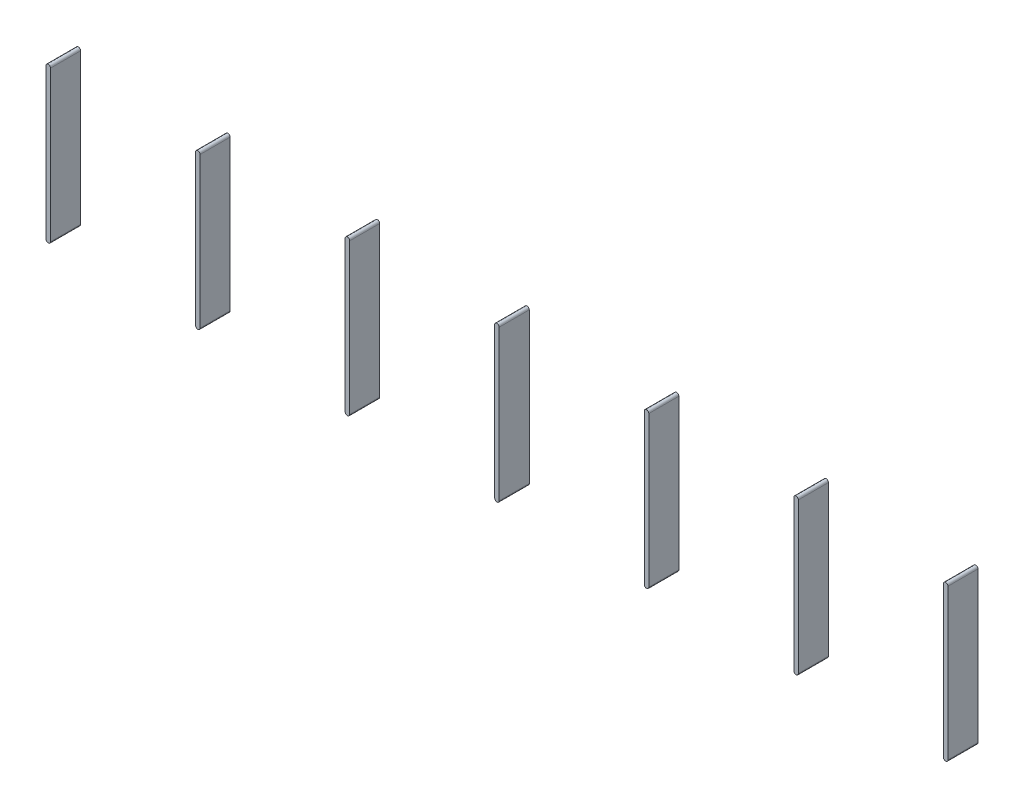
ISO-10303-21;
HEADER;
FILE_DESCRIPTION(('STEP AP214'),'2;1');
FILE_NAME('part.step','',(''),(''),'','','');
FILE_SCHEMA(('AUTOMOTIVE_DESIGN { 1 0 10303 214 1 1 1 1 }'));
ENDSEC;
DATA;
#1=APPLICATION_CONTEXT('core data for automotive mechanical design processes');
#2=APPLICATION_PROTOCOL_DEFINITION('international standard','automotive_design',2000,#1);
#3=PRODUCT_CONTEXT('',#1,'mechanical');
#4=PRODUCT('Part','Part','',(#3));
#5=PRODUCT_RELATED_PRODUCT_CATEGORY('part','',(#4));
#6=PRODUCT_DEFINITION_FORMATION('','',#4);
#7=PRODUCT_DEFINITION_CONTEXT('part definition',#1,'design');
#8=PRODUCT_DEFINITION('design','',#6,#7);
#9=PRODUCT_DEFINITION_SHAPE('','',#8);
#10=(LENGTH_UNIT() NAMED_UNIT(*) SI_UNIT(.MILLI.,.METRE.));
#11=(NAMED_UNIT(*) PLANE_ANGLE_UNIT() SI_UNIT($,.RADIAN.));
#12=(NAMED_UNIT(*) SI_UNIT($,.STERADIAN.) SOLID_ANGLE_UNIT());
#13=UNCERTAINTY_MEASURE_WITH_UNIT(LENGTH_MEASURE(1.E-05),#10,'distance_accuracy_value','');
#14=(GEOMETRIC_REPRESENTATION_CONTEXT(3) GLOBAL_UNCERTAINTY_ASSIGNED_CONTEXT((#13)) GLOBAL_UNIT_ASSIGNED_CONTEXT((#10,
#11,#12)) REPRESENTATION_CONTEXT('',''));
#15=CARTESIAN_POINT('',(0.,0.,0.));
#16=DIRECTION('',(0.,0.,1.));
#17=DIRECTION('',(1.,0.,0.));
#18=AXIS2_PLACEMENT_3D('',#15,#16,#17);
#19=CARTESIAN_POINT('',(-79.6,0.,4.));
#20=DIRECTION('',(0.,0.,-1.));
#21=DIRECTION('',(-1.,0.,0.));
#22=AXIS2_PLACEMENT_3D('',#19,#20,#21);
#23=CYLINDRICAL_SURFACE('',#22,0.299999999999995);
#24=CARTESIAN_POINT('',(-79.6,0.,0.));
#25=DIRECTION('',(0.,0.,1.));
#26=DIRECTION('',(1.,0.,0.));
#27=AXIS2_PLACEMENT_3D('',#24,#25,#26);
#28=CIRCLE('',#27,0.299999999999995);
#29=CARTESIAN_POINT('',(-79.3,0.,0.));
#30=VERTEX_POINT('',#29);
#31=CARTESIAN_POINT('',(-79.9,0.,0.));
#32=VERTEX_POINT('',#31);
#33=EDGE_CURVE('E107',#30,#32,#28,.T.);
#34=ORIENTED_EDGE('',*,*,#33,.T.);
#35=DIRECTION('',(0.,0.,-1.));
#36=VECTOR('',#35,1.);
#37=CARTESIAN_POINT('',(-79.9,0.,4.));
#38=LINE('',#37,#36);
#39=CARTESIAN_POINT('',(-79.9,0.,4.));
#40=VERTEX_POINT('',#39);
#41=EDGE_CURVE('E12',#40,#32,#38,.T.);
#42=ORIENTED_EDGE('',*,*,#41,.F.);
#43=CARTESIAN_POINT('',(-79.6,0.,4.));
#44=DIRECTION('',(0.,0.,1.));
#45=DIRECTION('',(1.,0.,0.));
#46=AXIS2_PLACEMENT_3D('',#43,#44,#45);
#47=CIRCLE('',#46,0.299999999999995);
#48=CARTESIAN_POINT('',(-79.3,0.,4.));
#49=VERTEX_POINT('',#48);
#50=EDGE_CURVE('E95',#49,#40,#47,.T.);
#51=ORIENTED_EDGE('',*,*,#50,.F.);
#52=DIRECTION('',(0.,0.,-1.));
#53=VECTOR('',#52,1.);
#54=CARTESIAN_POINT('',(-79.3,0.,4.));
#55=LINE('',#54,#53);
#56=EDGE_CURVE('E103',#49,#30,#55,.T.);
#57=ORIENTED_EDGE('',*,*,#56,.T.);
#58=EDGE_LOOP('',(#34,#42,#51,#57));
#59=FACE_BOUND('',#58,.T.);
#60=ADVANCED_FACE('F44',(#59),#23,.T.);
#61=CARTESIAN_POINT('',(-79.9,0.,4.));
#62=DIRECTION('',(1.,0.,0.));
#63=DIRECTION('',(0.,0.,-1.));
#64=AXIS2_PLACEMENT_3D('',#61,#62,#63);
#65=PLANE('',#64);
#66=DIRECTION('',(0.,-1.,0.));
#67=VECTOR('',#66,1.);
#68=CARTESIAN_POINT('',(-79.9,0.,0.));
#69=LINE('',#68,#67);
#70=CARTESIAN_POINT('',(-79.9,-20.,0.));
#71=VERTEX_POINT('',#70);
#72=EDGE_CURVE('E99',#32,#71,#69,.T.);
#73=ORIENTED_EDGE('',*,*,#72,.T.);
#74=DIRECTION('',(0.,0.,-1.));
#75=VECTOR('',#74,1.);
#76=CARTESIAN_POINT('',(-79.9,-20.,4.));
#77=LINE('',#76,#75);
#78=CARTESIAN_POINT('',(-79.9,-20.,4.));
#79=VERTEX_POINT('',#78);
#80=EDGE_CURVE('E52',#79,#71,#77,.T.);
#81=ORIENTED_EDGE('',*,*,#80,.F.);
#82=DIRECTION('',(0.,-1.,0.));
#83=VECTOR('',#82,1.);
#84=CARTESIAN_POINT('',(-79.9,0.,4.));
#85=LINE('',#84,#83);
#86=EDGE_CURVE('E90',#40,#79,#85,.T.);
#87=ORIENTED_EDGE('',*,*,#86,.F.);
#88=ORIENTED_EDGE('',*,*,#41,.T.);
#89=EDGE_LOOP('',(#73,#81,#87,#88));
#90=FACE_BOUND('',#89,.T.);
#91=ADVANCED_FACE('F98',(#90),#65,.F.);
#92=CARTESIAN_POINT('',(-79.6,-20.,4.));
#93=DIRECTION('',(0.,0.,-1.));
#94=DIRECTION('',(-1.,0.,0.));
#95=AXIS2_PLACEMENT_3D('',#92,#93,#94);
#96=CYLINDRICAL_SURFACE('',#95,0.299999999999995);
#97=CARTESIAN_POINT('',(-79.6,-20.,0.));
#98=DIRECTION('',(0.,0.,1.));
#99=DIRECTION('',(1.,0.,0.));
#100=AXIS2_PLACEMENT_3D('',#97,#98,#99);
#101=CIRCLE('',#100,0.299999999999995);
#102=CARTESIAN_POINT('',(-79.3,-20.,0.));
#103=VERTEX_POINT('',#102);
#104=EDGE_CURVE('E77',#71,#103,#101,.T.);
#105=ORIENTED_EDGE('',*,*,#104,.T.);
#106=DIRECTION('',(0.,0.,-1.));
#107=VECTOR('',#106,1.);
#108=CARTESIAN_POINT('',(-79.3,-20.,4.));
#109=LINE('',#108,#107);
#110=CARTESIAN_POINT('',(-79.3,-20.,4.));
#111=VERTEX_POINT('',#110);
#112=EDGE_CURVE('E100',#111,#103,#109,.T.);
#113=ORIENTED_EDGE('',*,*,#112,.F.);
#114=CARTESIAN_POINT('',(-79.6,-20.,4.));
#115=DIRECTION('',(0.,0.,1.));
#116=DIRECTION('',(1.,0.,0.));
#117=AXIS2_PLACEMENT_3D('',#114,#115,#116);
#118=CIRCLE('',#117,0.299999999999995);
#119=EDGE_CURVE('E93',#79,#111,#118,.T.);
#120=ORIENTED_EDGE('',*,*,#119,.F.);
#121=ORIENTED_EDGE('',*,*,#80,.T.);
#122=EDGE_LOOP('',(#105,#113,#120,#121));
#123=FACE_BOUND('',#122,.T.);
#124=ADVANCED_FACE('F101',(#123),#96,.T.);
#125=CARTESIAN_POINT('',(-79.3,0.,4.));
#126=DIRECTION('',(-1.,0.,0.));
#127=DIRECTION('',(0.,0.,1.));
#128=AXIS2_PLACEMENT_3D('',#125,#126,#127);
#129=PLANE('',#128);
#130=DIRECTION('',(0.,1.,0.));
#131=VECTOR('',#130,1.);
#132=CARTESIAN_POINT('',(-79.3,0.,0.));
#133=LINE('',#132,#131);
#134=EDGE_CURVE('E83',#103,#30,#133,.T.);
#135=ORIENTED_EDGE('',*,*,#134,.T.);
#136=ORIENTED_EDGE('',*,*,#56,.F.);
#137=DIRECTION('',(0.,1.,0.));
#138=VECTOR('',#137,1.);
#139=CARTESIAN_POINT('',(-79.3,0.,4.));
#140=LINE('',#139,#138);
#141=EDGE_CURVE('E60',#111,#49,#140,.T.);
#142=ORIENTED_EDGE('',*,*,#141,.F.);
#143=ORIENTED_EDGE('',*,*,#112,.T.);
#144=EDGE_LOOP('',(#135,#136,#142,#143));
#145=FACE_BOUND('',#144,.T.);
#146=ADVANCED_FACE('F114',(#145),#129,.F.);
#147=CARTESIAN_POINT('',(-79.6,0.,4.));
#148=DIRECTION('',(0.,0.,1.));
#149=DIRECTION('',(1.,0.,0.));
#150=AXIS2_PLACEMENT_3D('',#147,#148,#149);
#151=PLANE('',#150);
#152=ORIENTED_EDGE('',*,*,#50,.T.);
#153=ORIENTED_EDGE('',*,*,#86,.T.);
#154=ORIENTED_EDGE('',*,*,#119,.T.);
#155=ORIENTED_EDGE('',*,*,#141,.T.);
#156=EDGE_LOOP('',(#152,#153,#154,#155));
#157=FACE_BOUND('',#156,.T.);
#158=ADVANCED_FACE('F91',(#157),#151,.T.);
#159=CARTESIAN_POINT('',(-79.6,0.,0.));
#160=DIRECTION('',(0.,0.,1.));
#161=DIRECTION('',(1.,0.,0.));
#162=AXIS2_PLACEMENT_3D('',#159,#160,#161);
#163=PLANE('',#162);
#164=ORIENTED_EDGE('',*,*,#33,.F.);
#165=ORIENTED_EDGE('',*,*,#134,.F.);
#166=ORIENTED_EDGE('',*,*,#104,.F.);
#167=ORIENTED_EDGE('',*,*,#72,.F.);
#168=EDGE_LOOP('',(#164,#165,#166,#167));
#169=FACE_BOUND('',#168,.T.);
#170=ADVANCED_FACE('F117',(#169),#163,.F.);
#171=CLOSED_SHELL('',(#60,#91,#124,#146,#158,#170));
#172=MANIFOLD_SOLID_BREP('B2',#171);
#173=CARTESIAN_POINT('',(-59.7,0.,4.));
#174=DIRECTION('',(0.,0.,-1.));
#175=DIRECTION('',(-1.,0.,0.));
#176=AXIS2_PLACEMENT_3D('',#173,#174,#175);
#177=CYLINDRICAL_SURFACE('',#176,0.300000000000002);
#178=CARTESIAN_POINT('',(-59.7,0.,0.));
#179=DIRECTION('',(0.,0.,1.));
#180=DIRECTION('',(1.,0.,0.));
#181=AXIS2_PLACEMENT_3D('',#178,#179,#180);
#182=CIRCLE('',#181,0.300000000000002);
#183=CARTESIAN_POINT('',(-59.4,0.,0.));
#184=VERTEX_POINT('',#183);
#185=CARTESIAN_POINT('',(-60.,0.,0.));
#186=VERTEX_POINT('',#185);
#187=EDGE_CURVE('E241',#184,#186,#182,.T.);
#188=ORIENTED_EDGE('',*,*,#187,.T.);
#189=DIRECTION('',(0.,0.,-1.));
#190=VECTOR('',#189,1.);
#191=CARTESIAN_POINT('',(-60.,0.,4.));
#192=LINE('',#191,#190);
#193=CARTESIAN_POINT('',(-60.,0.,4.));
#194=VERTEX_POINT('',#193);
#195=EDGE_CURVE('E42',#194,#186,#192,.T.);
#196=ORIENTED_EDGE('',*,*,#195,.F.);
#197=CARTESIAN_POINT('',(-59.7,0.,4.));
#198=DIRECTION('',(0.,0.,1.));
#199=DIRECTION('',(1.,0.,0.));
#200=AXIS2_PLACEMENT_3D('',#197,#198,#199);
#201=CIRCLE('',#200,0.300000000000002);
#202=CARTESIAN_POINT('',(-59.4,0.,4.));
#203=VERTEX_POINT('',#202);
#204=EDGE_CURVE('E229',#203,#194,#201,.T.);
#205=ORIENTED_EDGE('',*,*,#204,.F.);
#206=DIRECTION('',(0.,0.,-1.));
#207=VECTOR('',#206,1.);
#208=CARTESIAN_POINT('',(-59.4,0.,4.));
#209=LINE('',#208,#207);
#210=EDGE_CURVE('E237',#203,#184,#209,.T.);
#211=ORIENTED_EDGE('',*,*,#210,.T.);
#212=EDGE_LOOP('',(#188,#196,#205,#211));
#213=FACE_BOUND('',#212,.T.);
#214=ADVANCED_FACE('F178',(#213),#177,.T.);
#215=CARTESIAN_POINT('',(-60.,0.,4.));
#216=DIRECTION('',(1.,0.,0.));
#217=DIRECTION('',(0.,1.,0.));
#218=AXIS2_PLACEMENT_3D('',#215,#216,#217);
#219=PLANE('',#218);
#220=DIRECTION('',(0.,-1.,0.));
#221=VECTOR('',#220,1.);
#222=CARTESIAN_POINT('',(-60.,0.,0.));
#223=LINE('',#222,#221);
#224=CARTESIAN_POINT('',(-60.,-20.,0.));
#225=VERTEX_POINT('',#224);
#226=EDGE_CURVE('E233',#186,#225,#223,.T.);
#227=ORIENTED_EDGE('',*,*,#226,.T.);
#228=DIRECTION('',(0.,0.,-1.));
#229=VECTOR('',#228,1.);
#230=CARTESIAN_POINT('',(-60.,-20.,4.));
#231=LINE('',#230,#229);
#232=CARTESIAN_POINT('',(-60.,-20.,4.));
#233=VERTEX_POINT('',#232);
#234=EDGE_CURVE('E186',#233,#225,#231,.T.);
#235=ORIENTED_EDGE('',*,*,#234,.F.);
#236=DIRECTION('',(0.,-1.,0.));
#237=VECTOR('',#236,1.);
#238=CARTESIAN_POINT('',(-60.,0.,4.));
#239=LINE('',#238,#237);
#240=EDGE_CURVE('E224',#194,#233,#239,.T.);
#241=ORIENTED_EDGE('',*,*,#240,.F.);
#242=ORIENTED_EDGE('',*,*,#195,.T.);
#243=EDGE_LOOP('',(#227,#235,#241,#242));
#244=FACE_BOUND('',#243,.T.);
#245=ADVANCED_FACE('F232',(#244),#219,.F.);
#246=CARTESIAN_POINT('',(-59.7,-20.,4.));
#247=DIRECTION('',(0.,0.,-1.));
#248=DIRECTION('',(-1.,0.,0.));
#249=AXIS2_PLACEMENT_3D('',#246,#247,#248);
#250=CYLINDRICAL_SURFACE('',#249,0.300000000000005);
#251=CARTESIAN_POINT('',(-59.7,-20.,0.));
#252=DIRECTION('',(0.,0.,1.));
#253=DIRECTION('',(1.,0.,0.));
#254=AXIS2_PLACEMENT_3D('',#251,#252,#253);
#255=CIRCLE('',#254,0.300000000000005);
#256=CARTESIAN_POINT('',(-59.4,-20.,0.));
#257=VERTEX_POINT('',#256);
#258=EDGE_CURVE('E211',#225,#257,#255,.T.);
#259=ORIENTED_EDGE('',*,*,#258,.T.);
#260=DIRECTION('',(0.,0.,-1.));
#261=VECTOR('',#260,1.);
#262=CARTESIAN_POINT('',(-59.4,-20.,4.));
#263=LINE('',#262,#261);
#264=CARTESIAN_POINT('',(-59.4,-20.,4.));
#265=VERTEX_POINT('',#264);
#266=EDGE_CURVE('E234',#265,#257,#263,.T.);
#267=ORIENTED_EDGE('',*,*,#266,.F.);
#268=CARTESIAN_POINT('',(-59.7,-20.,4.));
#269=DIRECTION('',(0.,0.,1.));
#270=DIRECTION('',(1.,0.,0.));
#271=AXIS2_PLACEMENT_3D('',#268,#269,#270);
#272=CIRCLE('',#271,0.300000000000005);
#273=EDGE_CURVE('E227',#233,#265,#272,.T.);
#274=ORIENTED_EDGE('',*,*,#273,.F.);
#275=ORIENTED_EDGE('',*,*,#234,.T.);
#276=EDGE_LOOP('',(#259,#267,#274,#275));
#277=FACE_BOUND('',#276,.T.);
#278=ADVANCED_FACE('F235',(#277),#250,.T.);
#279=CARTESIAN_POINT('',(-59.4,0.,4.));
#280=DIRECTION('',(-1.,0.,0.));
#281=DIRECTION('',(0.,0.,1.));
#282=AXIS2_PLACEMENT_3D('',#279,#280,#281);
#283=PLANE('',#282);
#284=DIRECTION('',(0.,1.,0.));
#285=VECTOR('',#284,1.);
#286=CARTESIAN_POINT('',(-59.4,0.,0.));
#287=LINE('',#286,#285);
#288=EDGE_CURVE('E217',#257,#184,#287,.T.);
#289=ORIENTED_EDGE('',*,*,#288,.T.);
#290=ORIENTED_EDGE('',*,*,#210,.F.);
#291=DIRECTION('',(0.,1.,0.));
#292=VECTOR('',#291,1.);
#293=CARTESIAN_POINT('',(-59.4,0.,4.));
#294=LINE('',#293,#292);
#295=EDGE_CURVE('E194',#265,#203,#294,.T.);
#296=ORIENTED_EDGE('',*,*,#295,.F.);
#297=ORIENTED_EDGE('',*,*,#266,.T.);
#298=EDGE_LOOP('',(#289,#290,#296,#297));
#299=FACE_BOUND('',#298,.T.);
#300=ADVANCED_FACE('F248',(#299),#283,.F.);
#301=CARTESIAN_POINT('',(-59.7,0.,4.));
#302=DIRECTION('',(0.,0.,1.));
#303=DIRECTION('',(1.,0.,0.));
#304=AXIS2_PLACEMENT_3D('',#301,#302,#303);
#305=PLANE('',#304);
#306=ORIENTED_EDGE('',*,*,#204,.T.);
#307=ORIENTED_EDGE('',*,*,#240,.T.);
#308=ORIENTED_EDGE('',*,*,#273,.T.);
#309=ORIENTED_EDGE('',*,*,#295,.T.);
#310=EDGE_LOOP('',(#306,#307,#308,#309));
#311=FACE_BOUND('',#310,.T.);
#312=ADVANCED_FACE('F225',(#311),#305,.T.);
#313=CARTESIAN_POINT('',(-59.7,0.,0.));
#314=DIRECTION('',(0.,0.,1.));
#315=DIRECTION('',(1.,0.,0.));
#316=AXIS2_PLACEMENT_3D('',#313,#314,#315);
#317=PLANE('',#316);
#318=ORIENTED_EDGE('',*,*,#187,.F.);
#319=ORIENTED_EDGE('',*,*,#288,.F.);
#320=ORIENTED_EDGE('',*,*,#258,.F.);
#321=ORIENTED_EDGE('',*,*,#226,.F.);
#322=EDGE_LOOP('',(#318,#319,#320,#321));
#323=FACE_BOUND('',#322,.T.);
#324=ADVANCED_FACE('F251',(#323),#317,.F.);
#325=CLOSED_SHELL('',(#214,#245,#278,#300,#312,#324));
#326=MANIFOLD_SOLID_BREP('B6',#325);
#327=CARTESIAN_POINT('',(-39.8,0.,4.));
#328=DIRECTION('',(0.,0.,-1.));
#329=DIRECTION('',(-1.,0.,0.));
#330=AXIS2_PLACEMENT_3D('',#327,#328,#329);
#331=CYLINDRICAL_SURFACE('',#330,0.300000000000002);
#332=CARTESIAN_POINT('',(-39.8,0.,0.));
#333=DIRECTION('',(0.,0.,1.));
#334=DIRECTION('',(1.,0.,0.));
#335=AXIS2_PLACEMENT_3D('',#332,#333,#334);
#336=CIRCLE('',#335,0.300000000000002);
#337=CARTESIAN_POINT('',(-39.5,0.,0.));
#338=VERTEX_POINT('',#337);
#339=CARTESIAN_POINT('',(-40.1,0.,0.));
#340=VERTEX_POINT('',#339);
#341=EDGE_CURVE('E375',#338,#340,#336,.T.);
#342=ORIENTED_EDGE('',*,*,#341,.T.);
#343=DIRECTION('',(0.,0.,-1.));
#344=VECTOR('',#343,1.);
#345=CARTESIAN_POINT('',(-40.1,0.,4.));
#346=LINE('',#345,#344);
#347=CARTESIAN_POINT('',(-40.1,0.,4.));
#348=VERTEX_POINT('',#347);
#349=EDGE_CURVE('E176',#348,#340,#346,.T.);
#350=ORIENTED_EDGE('',*,*,#349,.F.);
#351=CARTESIAN_POINT('',(-39.8,0.,4.));
#352=DIRECTION('',(0.,0.,1.));
#353=DIRECTION('',(1.,0.,0.));
#354=AXIS2_PLACEMENT_3D('',#351,#352,#353);
#355=CIRCLE('',#354,0.300000000000002);
#356=CARTESIAN_POINT('',(-39.5,0.,4.));
#357=VERTEX_POINT('',#356);
#358=EDGE_CURVE('E363',#357,#348,#355,.T.);
#359=ORIENTED_EDGE('',*,*,#358,.F.);
#360=DIRECTION('',(0.,0.,-1.));
#361=VECTOR('',#360,1.);
#362=CARTESIAN_POINT('',(-39.5,0.,4.));
#363=LINE('',#362,#361);
#364=EDGE_CURVE('E371',#357,#338,#363,.T.);
#365=ORIENTED_EDGE('',*,*,#364,.T.);
#366=EDGE_LOOP('',(#342,#350,#359,#365));
#367=FACE_BOUND('',#366,.T.);
#368=ADVANCED_FACE('F312',(#367),#331,.T.);
#369=CARTESIAN_POINT('',(-40.1,0.,4.));
#370=DIRECTION('',(1.,0.,0.));
#371=DIRECTION('',(0.,1.,0.));
#372=AXIS2_PLACEMENT_3D('',#369,#370,#371);
#373=PLANE('',#372);
#374=DIRECTION('',(0.,-1.,0.));
#375=VECTOR('',#374,1.);
#376=CARTESIAN_POINT('',(-40.1,0.,0.));
#377=LINE('',#376,#375);
#378=CARTESIAN_POINT('',(-40.1,-20.,0.));
#379=VERTEX_POINT('',#378);
#380=EDGE_CURVE('E367',#340,#379,#377,.T.);
#381=ORIENTED_EDGE('',*,*,#380,.T.);
#382=DIRECTION('',(0.,0.,-1.));
#383=VECTOR('',#382,1.);
#384=CARTESIAN_POINT('',(-40.1,-20.,4.));
#385=LINE('',#384,#383);
#386=CARTESIAN_POINT('',(-40.1,-20.,4.));
#387=VERTEX_POINT('',#386);
#388=EDGE_CURVE('E320',#387,#379,#385,.T.);
#389=ORIENTED_EDGE('',*,*,#388,.F.);
#390=DIRECTION('',(0.,-1.,0.));
#391=VECTOR('',#390,1.);
#392=CARTESIAN_POINT('',(-40.1,0.,4.));
#393=LINE('',#392,#391);
#394=EDGE_CURVE('E358',#348,#387,#393,.T.);
#395=ORIENTED_EDGE('',*,*,#394,.F.);
#396=ORIENTED_EDGE('',*,*,#349,.T.);
#397=EDGE_LOOP('',(#381,#389,#395,#396));
#398=FACE_BOUND('',#397,.T.);
#399=ADVANCED_FACE('F366',(#398),#373,.F.);
#400=CARTESIAN_POINT('',(-39.8,-20.,4.));
#401=DIRECTION('',(0.,0.,-1.));
#402=DIRECTION('',(-1.,0.,0.));
#403=AXIS2_PLACEMENT_3D('',#400,#401,#402);
#404=CYLINDRICAL_SURFACE('',#403,0.299999999999998);
#405=CARTESIAN_POINT('',(-39.8,-20.,0.));
#406=DIRECTION('',(0.,0.,1.));
#407=DIRECTION('',(1.,0.,0.));
#408=AXIS2_PLACEMENT_3D('',#405,#406,#407);
#409=CIRCLE('',#408,0.299999999999998);
#410=CARTESIAN_POINT('',(-39.5,-20.,0.));
#411=VERTEX_POINT('',#410);
#412=EDGE_CURVE('E345',#379,#411,#409,.T.);
#413=ORIENTED_EDGE('',*,*,#412,.T.);
#414=DIRECTION('',(0.,0.,-1.));
#415=VECTOR('',#414,1.);
#416=CARTESIAN_POINT('',(-39.5,-20.,4.));
#417=LINE('',#416,#415);
#418=CARTESIAN_POINT('',(-39.5,-20.,4.));
#419=VERTEX_POINT('',#418);
#420=EDGE_CURVE('E368',#419,#411,#417,.T.);
#421=ORIENTED_EDGE('',*,*,#420,.F.);
#422=CARTESIAN_POINT('',(-39.8,-20.,4.));
#423=DIRECTION('',(0.,0.,1.));
#424=DIRECTION('',(1.,0.,0.));
#425=AXIS2_PLACEMENT_3D('',#422,#423,#424);
#426=CIRCLE('',#425,0.299999999999998);
#427=EDGE_CURVE('E361',#387,#419,#426,.T.);
#428=ORIENTED_EDGE('',*,*,#427,.F.);
#429=ORIENTED_EDGE('',*,*,#388,.T.);
#430=EDGE_LOOP('',(#413,#421,#428,#429));
#431=FACE_BOUND('',#430,.T.);
#432=ADVANCED_FACE('F369',(#431),#404,.T.);
#433=CARTESIAN_POINT('',(-39.5,0.,4.));
#434=DIRECTION('',(-1.,0.,0.));
#435=DIRECTION('',(0.,0.,1.));
#436=AXIS2_PLACEMENT_3D('',#433,#434,#435);
#437=PLANE('',#436);
#438=DIRECTION('',(0.,1.,0.));
#439=VECTOR('',#438,1.);
#440=CARTESIAN_POINT('',(-39.5,0.,0.));
#441=LINE('',#440,#439);
#442=EDGE_CURVE('E351',#411,#338,#441,.T.);
#443=ORIENTED_EDGE('',*,*,#442,.T.);
#444=ORIENTED_EDGE('',*,*,#364,.F.);
#445=DIRECTION('',(0.,1.,0.));
#446=VECTOR('',#445,1.);
#447=CARTESIAN_POINT('',(-39.5,0.,4.));
#448=LINE('',#447,#446);
#449=EDGE_CURVE('E328',#419,#357,#448,.T.);
#450=ORIENTED_EDGE('',*,*,#449,.F.);
#451=ORIENTED_EDGE('',*,*,#420,.T.);
#452=EDGE_LOOP('',(#443,#444,#450,#451));
#453=FACE_BOUND('',#452,.T.);
#454=ADVANCED_FACE('F382',(#453),#437,.F.);
#455=CARTESIAN_POINT('',(-39.8,0.,4.));
#456=DIRECTION('',(0.,0.,1.));
#457=DIRECTION('',(1.,0.,0.));
#458=AXIS2_PLACEMENT_3D('',#455,#456,#457);
#459=PLANE('',#458);
#460=ORIENTED_EDGE('',*,*,#358,.T.);
#461=ORIENTED_EDGE('',*,*,#394,.T.);
#462=ORIENTED_EDGE('',*,*,#427,.T.);
#463=ORIENTED_EDGE('',*,*,#449,.T.);
#464=EDGE_LOOP('',(#460,#461,#462,#463));
#465=FACE_BOUND('',#464,.T.);
#466=ADVANCED_FACE('F359',(#465),#459,.T.);
#467=CARTESIAN_POINT('',(-39.8,0.,0.));
#468=DIRECTION('',(0.,0.,1.));
#469=DIRECTION('',(1.,0.,0.));
#470=AXIS2_PLACEMENT_3D('',#467,#468,#469);
#471=PLANE('',#470);
#472=ORIENTED_EDGE('',*,*,#341,.F.);
#473=ORIENTED_EDGE('',*,*,#442,.F.);
#474=ORIENTED_EDGE('',*,*,#412,.F.);
#475=ORIENTED_EDGE('',*,*,#380,.F.);
#476=EDGE_LOOP('',(#472,#473,#474,#475));
#477=FACE_BOUND('',#476,.T.);
#478=ADVANCED_FACE('F385',(#477),#471,.F.);
#479=CLOSED_SHELL('',(#368,#399,#432,#454,#466,#478));
#480=MANIFOLD_SOLID_BREP('B36',#479);
#481=CARTESIAN_POINT('',(-19.9,0.,4.));
#482=DIRECTION('',(0.,0.,-1.));
#483=DIRECTION('',(-1.,0.,0.));
#484=AXIS2_PLACEMENT_3D('',#481,#482,#483);
#485=CYLINDRICAL_SURFACE('',#484,0.300000000000002);
#486=CARTESIAN_POINT('',(-19.9,0.,0.));
#487=DIRECTION('',(0.,0.,1.));
#488=DIRECTION('',(1.,0.,0.));
#489=AXIS2_PLACEMENT_3D('',#486,#487,#488);
#490=CIRCLE('',#489,0.300000000000002);
#491=CARTESIAN_POINT('',(-19.6,0.,0.));
#492=VERTEX_POINT('',#491);
#493=CARTESIAN_POINT('',(-20.2,0.,0.));
#494=VERTEX_POINT('',#493);
#495=EDGE_CURVE('E509',#492,#494,#490,.T.);
#496=ORIENTED_EDGE('',*,*,#495,.T.);
#497=DIRECTION('',(0.,0.,-1.));
#498=VECTOR('',#497,1.);
#499=CARTESIAN_POINT('',(-20.2,0.,4.));
#500=LINE('',#499,#498);
#501=CARTESIAN_POINT('',(-20.2,0.,4.));
#502=VERTEX_POINT('',#501);
#503=EDGE_CURVE('E310',#502,#494,#500,.T.);
#504=ORIENTED_EDGE('',*,*,#503,.F.);
#505=CARTESIAN_POINT('',(-19.9,0.,4.));
#506=DIRECTION('',(0.,0.,1.));
#507=DIRECTION('',(1.,0.,0.));
#508=AXIS2_PLACEMENT_3D('',#505,#506,#507);
#509=CIRCLE('',#508,0.300000000000002);
#510=CARTESIAN_POINT('',(-19.6,0.,4.));
#511=VERTEX_POINT('',#510);
#512=EDGE_CURVE('E497',#511,#502,#509,.T.);
#513=ORIENTED_EDGE('',*,*,#512,.F.);
#514=DIRECTION('',(0.,0.,-1.));
#515=VECTOR('',#514,1.);
#516=CARTESIAN_POINT('',(-19.6,0.,4.));
#517=LINE('',#516,#515);
#518=EDGE_CURVE('E505',#511,#492,#517,.T.);
#519=ORIENTED_EDGE('',*,*,#518,.T.);
#520=EDGE_LOOP('',(#496,#504,#513,#519));
#521=FACE_BOUND('',#520,.T.);
#522=ADVANCED_FACE('F446',(#521),#485,.T.);
#523=CARTESIAN_POINT('',(-20.2,0.,4.));
#524=DIRECTION('',(1.,0.,0.));
#525=DIRECTION('',(0.,1.,0.));
#526=AXIS2_PLACEMENT_3D('',#523,#524,#525);
#527=PLANE('',#526);
#528=DIRECTION('',(0.,-1.,0.));
#529=VECTOR('',#528,1.);
#530=CARTESIAN_POINT('',(-20.2,0.,0.));
#531=LINE('',#530,#529);
#532=CARTESIAN_POINT('',(-20.2,-20.,0.));
#533=VERTEX_POINT('',#532);
#534=EDGE_CURVE('E501',#494,#533,#531,.T.);
#535=ORIENTED_EDGE('',*,*,#534,.T.);
#536=DIRECTION('',(0.,0.,-1.));
#537=VECTOR('',#536,1.);
#538=CARTESIAN_POINT('',(-20.2,-20.,4.));
#539=LINE('',#538,#537);
#540=CARTESIAN_POINT('',(-20.2,-20.,4.));
#541=VERTEX_POINT('',#540);
#542=EDGE_CURVE('E454',#541,#533,#539,.T.);
#543=ORIENTED_EDGE('',*,*,#542,.F.);
#544=DIRECTION('',(0.,-1.,0.));
#545=VECTOR('',#544,1.);
#546=CARTESIAN_POINT('',(-20.2,0.,4.));
#547=LINE('',#546,#545);
#548=EDGE_CURVE('E492',#502,#541,#547,.T.);
#549=ORIENTED_EDGE('',*,*,#548,.F.);
#550=ORIENTED_EDGE('',*,*,#503,.T.);
#551=EDGE_LOOP('',(#535,#543,#549,#550));
#552=FACE_BOUND('',#551,.T.);
#553=ADVANCED_FACE('F500',(#552),#527,.F.);
#554=CARTESIAN_POINT('',(-19.9,-20.,4.));
#555=DIRECTION('',(0.,0.,-1.));
#556=DIRECTION('',(-1.,0.,0.));
#557=AXIS2_PLACEMENT_3D('',#554,#555,#556);
#558=CYLINDRICAL_SURFACE('',#557,0.3);
#559=CARTESIAN_POINT('',(-19.9,-20.,0.));
#560=DIRECTION('',(0.,0.,1.));
#561=DIRECTION('',(1.,0.,0.));
#562=AXIS2_PLACEMENT_3D('',#559,#560,#561);
#563=CIRCLE('',#562,0.3);
#564=CARTESIAN_POINT('',(-19.6,-20.,0.));
#565=VERTEX_POINT('',#564);
#566=EDGE_CURVE('E479',#533,#565,#563,.T.);
#567=ORIENTED_EDGE('',*,*,#566,.T.);
#568=DIRECTION('',(0.,0.,-1.));
#569=VECTOR('',#568,1.);
#570=CARTESIAN_POINT('',(-19.6,-20.,4.));
#571=LINE('',#570,#569);
#572=CARTESIAN_POINT('',(-19.6,-20.,4.));
#573=VERTEX_POINT('',#572);
#574=EDGE_CURVE('E502',#573,#565,#571,.T.);
#575=ORIENTED_EDGE('',*,*,#574,.F.);
#576=CARTESIAN_POINT('',(-19.9,-20.,4.));
#577=DIRECTION('',(0.,0.,1.));
#578=DIRECTION('',(1.,0.,0.));
#579=AXIS2_PLACEMENT_3D('',#576,#577,#578);
#580=CIRCLE('',#579,0.3);
#581=EDGE_CURVE('E495',#541,#573,#580,.T.);
#582=ORIENTED_EDGE('',*,*,#581,.F.);
#583=ORIENTED_EDGE('',*,*,#542,.T.);
#584=EDGE_LOOP('',(#567,#575,#582,#583));
#585=FACE_BOUND('',#584,.T.);
#586=ADVANCED_FACE('F503',(#585),#558,.T.);
#587=CARTESIAN_POINT('',(-19.6,0.,4.));
#588=DIRECTION('',(-1.,0.,0.));
#589=DIRECTION('',(0.,0.,1.));
#590=AXIS2_PLACEMENT_3D('',#587,#588,#589);
#591=PLANE('',#590);
#592=DIRECTION('',(0.,1.,0.));
#593=VECTOR('',#592,1.);
#594=CARTESIAN_POINT('',(-19.6,0.,0.));
#595=LINE('',#594,#593);
#596=EDGE_CURVE('E485',#565,#492,#595,.T.);
#597=ORIENTED_EDGE('',*,*,#596,.T.);
#598=ORIENTED_EDGE('',*,*,#518,.F.);
#599=DIRECTION('',(0.,1.,0.));
#600=VECTOR('',#599,1.);
#601=CARTESIAN_POINT('',(-19.6,0.,4.));
#602=LINE('',#601,#600);
#603=EDGE_CURVE('E462',#573,#511,#602,.T.);
#604=ORIENTED_EDGE('',*,*,#603,.F.);
#605=ORIENTED_EDGE('',*,*,#574,.T.);
#606=EDGE_LOOP('',(#597,#598,#604,#605));
#607=FACE_BOUND('',#606,.T.);
#608=ADVANCED_FACE('F516',(#607),#591,.F.);
#609=CARTESIAN_POINT('',(-19.9,0.,4.));
#610=DIRECTION('',(0.,0.,1.));
#611=DIRECTION('',(1.,0.,0.));
#612=AXIS2_PLACEMENT_3D('',#609,#610,#611);
#613=PLANE('',#612);
#614=ORIENTED_EDGE('',*,*,#512,.T.);
#615=ORIENTED_EDGE('',*,*,#548,.T.);
#616=ORIENTED_EDGE('',*,*,#581,.T.);
#617=ORIENTED_EDGE('',*,*,#603,.T.);
#618=EDGE_LOOP('',(#614,#615,#616,#617));
#619=FACE_BOUND('',#618,.T.);
#620=ADVANCED_FACE('F493',(#619),#613,.T.);
#621=CARTESIAN_POINT('',(-19.9,0.,0.));
#622=DIRECTION('',(0.,0.,1.));
#623=DIRECTION('',(1.,0.,0.));
#624=AXIS2_PLACEMENT_3D('',#621,#622,#623);
#625=PLANE('',#624);
#626=ORIENTED_EDGE('',*,*,#495,.F.);
#627=ORIENTED_EDGE('',*,*,#596,.F.);
#628=ORIENTED_EDGE('',*,*,#566,.F.);
#629=ORIENTED_EDGE('',*,*,#534,.F.);
#630=EDGE_LOOP('',(#626,#627,#628,#629));
#631=FACE_BOUND('',#630,.T.);
#632=ADVANCED_FACE('F519',(#631),#625,.F.);
#633=CLOSED_SHELL('',(#522,#553,#586,#608,#620,#632));
#634=MANIFOLD_SOLID_BREP('B170',#633);
#635=CARTESIAN_POINT('',(19.9,0.,4.));
#636=DIRECTION('',(0.,0.,-1.));
#637=DIRECTION('',(-1.,0.,0.));
#638=AXIS2_PLACEMENT_3D('',#635,#636,#637);
#639=CYLINDRICAL_SURFACE('',#638,0.299999999999998);
#640=CARTESIAN_POINT('',(19.9,0.,0.));
#641=DIRECTION('',(0.,0.,1.));
#642=DIRECTION('',(1.,0.,0.));
#643=AXIS2_PLACEMENT_3D('',#640,#641,#642);
#644=CIRCLE('',#643,0.299999999999998);
#645=CARTESIAN_POINT('',(20.2,0.,0.));
#646=VERTEX_POINT('',#645);
#647=CARTESIAN_POINT('',(19.6,0.,0.));
#648=VERTEX_POINT('',#647);
#649=EDGE_CURVE('E643',#646,#648,#644,.T.);
#650=ORIENTED_EDGE('',*,*,#649,.T.);
#651=DIRECTION('',(0.,0.,-1.));
#652=VECTOR('',#651,1.);
#653=CARTESIAN_POINT('',(19.6,0.,4.));
#654=LINE('',#653,#652);
#655=CARTESIAN_POINT('',(19.6,0.,4.));
#656=VERTEX_POINT('',#655);
#657=EDGE_CURVE('E444',#656,#648,#654,.T.);
#658=ORIENTED_EDGE('',*,*,#657,.F.);
#659=CARTESIAN_POINT('',(19.9,0.,4.));
#660=DIRECTION('',(0.,0.,1.));
#661=DIRECTION('',(1.,0.,0.));
#662=AXIS2_PLACEMENT_3D('',#659,#660,#661);
#663=CIRCLE('',#662,0.299999999999998);
#664=CARTESIAN_POINT('',(20.2,0.,4.));
#665=VERTEX_POINT('',#664);
#666=EDGE_CURVE('E631',#665,#656,#663,.T.);
#667=ORIENTED_EDGE('',*,*,#666,.F.);
#668=DIRECTION('',(0.,0.,-1.));
#669=VECTOR('',#668,1.);
#670=CARTESIAN_POINT('',(20.2,0.,4.));
#671=LINE('',#670,#669);
#672=EDGE_CURVE('E639',#665,#646,#671,.T.);
#673=ORIENTED_EDGE('',*,*,#672,.T.);
#674=EDGE_LOOP('',(#650,#658,#667,#673));
#675=FACE_BOUND('',#674,.T.);
#676=ADVANCED_FACE('F580',(#675),#639,.T.);
#677=CARTESIAN_POINT('',(19.6,0.,4.));
#678=DIRECTION('',(1.,0.,0.));
#679=DIRECTION('',(0.,0.,-1.));
#680=AXIS2_PLACEMENT_3D('',#677,#678,#679);
#681=PLANE('',#680);
#682=DIRECTION('',(0.,-1.,0.));
#683=VECTOR('',#682,1.);
#684=CARTESIAN_POINT('',(19.6,0.,0.));
#685=LINE('',#684,#683);
#686=CARTESIAN_POINT('',(19.6,-20.,0.));
#687=VERTEX_POINT('',#686);
#688=EDGE_CURVE('E635',#648,#687,#685,.T.);
#689=ORIENTED_EDGE('',*,*,#688,.T.);
#690=DIRECTION('',(0.,0.,-1.));
#691=VECTOR('',#690,1.);
#692=CARTESIAN_POINT('',(19.6,-20.,4.));
#693=LINE('',#692,#691);
#694=CARTESIAN_POINT('',(19.6,-20.,4.));
#695=VERTEX_POINT('',#694);
#696=EDGE_CURVE('E588',#695,#687,#693,.T.);
#697=ORIENTED_EDGE('',*,*,#696,.F.);
#698=DIRECTION('',(0.,-1.,0.));
#699=VECTOR('',#698,1.);
#700=CARTESIAN_POINT('',(19.6,0.,4.));
#701=LINE('',#700,#699);
#702=EDGE_CURVE('E626',#656,#695,#701,.T.);
#703=ORIENTED_EDGE('',*,*,#702,.F.);
#704=ORIENTED_EDGE('',*,*,#657,.T.);
#705=EDGE_LOOP('',(#689,#697,#703,#704));
#706=FACE_BOUND('',#705,.T.);
#707=ADVANCED_FACE('F634',(#706),#681,.F.);
#708=CARTESIAN_POINT('',(19.9,-20.,4.));
#709=DIRECTION('',(0.,0.,-1.));
#710=DIRECTION('',(-1.,0.,0.));
#711=AXIS2_PLACEMENT_3D('',#708,#709,#710);
#712=CYLINDRICAL_SURFACE('',#711,0.3);
#713=CARTESIAN_POINT('',(19.9,-20.,0.));
#714=DIRECTION('',(0.,0.,1.));
#715=DIRECTION('',(1.,0.,0.));
#716=AXIS2_PLACEMENT_3D('',#713,#714,#715);
#717=CIRCLE('',#716,0.3);
#718=CARTESIAN_POINT('',(20.2,-20.,0.));
#719=VERTEX_POINT('',#718);
#720=EDGE_CURVE('E613',#687,#719,#717,.T.);
#721=ORIENTED_EDGE('',*,*,#720,.T.);
#722=DIRECTION('',(0.,0.,-1.));
#723=VECTOR('',#722,1.);
#724=CARTESIAN_POINT('',(20.2,-20.,4.));
#725=LINE('',#724,#723);
#726=CARTESIAN_POINT('',(20.2,-20.,4.));
#727=VERTEX_POINT('',#726);
#728=EDGE_CURVE('E636',#727,#719,#725,.T.);
#729=ORIENTED_EDGE('',*,*,#728,.F.);
#730=CARTESIAN_POINT('',(19.9,-20.,4.));
#731=DIRECTION('',(0.,0.,1.));
#732=DIRECTION('',(1.,0.,0.));
#733=AXIS2_PLACEMENT_3D('',#730,#731,#732);
#734=CIRCLE('',#733,0.3);
#735=EDGE_CURVE('E629',#695,#727,#734,.T.);
#736=ORIENTED_EDGE('',*,*,#735,.F.);
#737=ORIENTED_EDGE('',*,*,#696,.T.);
#738=EDGE_LOOP('',(#721,#729,#736,#737));
#739=FACE_BOUND('',#738,.T.);
#740=ADVANCED_FACE('F637',(#739),#712,.T.);
#741=CARTESIAN_POINT('',(20.2,0.,4.));
#742=DIRECTION('',(-1.,0.,0.));
#743=DIRECTION('',(0.,-1.,0.));
#744=AXIS2_PLACEMENT_3D('',#741,#742,#743);
#745=PLANE('',#744);
#746=DIRECTION('',(0.,1.,0.));
#747=VECTOR('',#746,1.);
#748=CARTESIAN_POINT('',(20.2,0.,0.));
#749=LINE('',#748,#747);
#750=EDGE_CURVE('E619',#719,#646,#749,.T.);
#751=ORIENTED_EDGE('',*,*,#750,.T.);
#752=ORIENTED_EDGE('',*,*,#672,.F.);
#753=DIRECTION('',(0.,1.,0.));
#754=VECTOR('',#753,1.);
#755=CARTESIAN_POINT('',(20.2,0.,4.));
#756=LINE('',#755,#754);
#757=EDGE_CURVE('E596',#727,#665,#756,.T.);
#758=ORIENTED_EDGE('',*,*,#757,.F.);
#759=ORIENTED_EDGE('',*,*,#728,.T.);
#760=EDGE_LOOP('',(#751,#752,#758,#759));
#761=FACE_BOUND('',#760,.T.);
#762=ADVANCED_FACE('F650',(#761),#745,.F.);
#763=CARTESIAN_POINT('',(19.9,0.,4.));
#764=DIRECTION('',(0.,0.,1.));
#765=DIRECTION('',(1.,0.,0.));
#766=AXIS2_PLACEMENT_3D('',#763,#764,#765);
#767=PLANE('',#766);
#768=ORIENTED_EDGE('',*,*,#666,.T.);
#769=ORIENTED_EDGE('',*,*,#702,.T.);
#770=ORIENTED_EDGE('',*,*,#735,.T.);
#771=ORIENTED_EDGE('',*,*,#757,.T.);
#772=EDGE_LOOP('',(#768,#769,#770,#771));
#773=FACE_BOUND('',#772,.T.);
#774=ADVANCED_FACE('F627',(#773),#767,.T.);
#775=CARTESIAN_POINT('',(19.9,0.,0.));
#776=DIRECTION('',(0.,0.,1.));
#777=DIRECTION('',(1.,0.,0.));
#778=AXIS2_PLACEMENT_3D('',#775,#776,#777);
#779=PLANE('',#778);
#780=ORIENTED_EDGE('',*,*,#649,.F.);
#781=ORIENTED_EDGE('',*,*,#750,.F.);
#782=ORIENTED_EDGE('',*,*,#720,.F.);
#783=ORIENTED_EDGE('',*,*,#688,.F.);
#784=EDGE_LOOP('',(#780,#781,#782,#783));
#785=FACE_BOUND('',#784,.T.);
#786=ADVANCED_FACE('F653',(#785),#779,.F.);
#787=CLOSED_SHELL('',(#676,#707,#740,#762,#774,#786));
#788=MANIFOLD_SOLID_BREP('B304',#787);
#789=CARTESIAN_POINT('',(39.8,0.,4.));
#790=DIRECTION('',(0.,0.,-1.));
#791=DIRECTION('',(-1.,0.,0.));
#792=AXIS2_PLACEMENT_3D('',#789,#790,#791);
#793=CYLINDRICAL_SURFACE('',#792,0.300000000000002);
#794=CARTESIAN_POINT('',(39.8,0.,0.));
#795=DIRECTION('',(0.,0.,1.));
#796=DIRECTION('',(1.,0.,0.));
#797=AXIS2_PLACEMENT_3D('',#794,#795,#796);
#798=CIRCLE('',#797,0.300000000000002);
#799=CARTESIAN_POINT('',(40.1,0.,0.));
#800=VERTEX_POINT('',#799);
#801=CARTESIAN_POINT('',(39.5,0.,0.));
#802=VERTEX_POINT('',#801);
#803=EDGE_CURVE('E776',#800,#802,#798,.T.);
#804=ORIENTED_EDGE('',*,*,#803,.T.);
#805=DIRECTION('',(0.,0.,-1.));
#806=VECTOR('',#805,1.);
#807=CARTESIAN_POINT('',(39.5,0.,4.));
#808=LINE('',#807,#806);
#809=CARTESIAN_POINT('',(39.5,0.,4.));
#810=VERTEX_POINT('',#809);
#811=EDGE_CURVE('E578',#810,#802,#808,.T.);
#812=ORIENTED_EDGE('',*,*,#811,.F.);
#813=CARTESIAN_POINT('',(39.8,0.,4.));
#814=DIRECTION('',(0.,0.,1.));
#815=DIRECTION('',(1.,0.,0.));
#816=AXIS2_PLACEMENT_3D('',#813,#814,#815);
#817=CIRCLE('',#816,0.300000000000002);
#818=CARTESIAN_POINT('',(40.1,0.,4.));
#819=VERTEX_POINT('',#818);
#820=EDGE_CURVE('E764',#819,#810,#817,.T.);
#821=ORIENTED_EDGE('',*,*,#820,.F.);
#822=DIRECTION('',(0.,0.,-1.));
#823=VECTOR('',#822,1.);
#824=CARTESIAN_POINT('',(40.1,0.,4.));
#825=LINE('',#824,#823);
#826=EDGE_CURVE('E772',#819,#800,#825,.T.);
#827=ORIENTED_EDGE('',*,*,#826,.T.);
#828=EDGE_LOOP('',(#804,#812,#821,#827));
#829=FACE_BOUND('',#828,.T.);
#830=ADVANCED_FACE('F713',(#829),#793,.T.);
#831=CARTESIAN_POINT('',(39.5,0.,4.));
#832=DIRECTION('',(1.,0.,0.));
#833=DIRECTION('',(0.,1.,0.));
#834=AXIS2_PLACEMENT_3D('',#831,#832,#833);
#835=PLANE('',#834);
#836=DIRECTION('',(0.,-1.,0.));
#837=VECTOR('',#836,1.);
#838=CARTESIAN_POINT('',(39.5,0.,0.));
#839=LINE('',#838,#837);
#840=CARTESIAN_POINT('',(39.5,-20.,0.));
#841=VERTEX_POINT('',#840);
#842=EDGE_CURVE('E768',#802,#841,#839,.T.);
#843=ORIENTED_EDGE('',*,*,#842,.T.);
#844=DIRECTION('',(0.,0.,-1.));
#845=VECTOR('',#844,1.);
#846=CARTESIAN_POINT('',(39.5,-20.,4.));
#847=LINE('',#846,#845);
#848=CARTESIAN_POINT('',(39.5,-20.,4.));
#849=VERTEX_POINT('',#848);
#850=EDGE_CURVE('E721',#849,#841,#847,.T.);
#851=ORIENTED_EDGE('',*,*,#850,.F.);
#852=DIRECTION('',(0.,-1.,0.));
#853=VECTOR('',#852,1.);
#854=CARTESIAN_POINT('',(39.5,0.,4.));
#855=LINE('',#854,#853);
#856=EDGE_CURVE('E759',#810,#849,#855,.T.);
#857=ORIENTED_EDGE('',*,*,#856,.F.);
#858=ORIENTED_EDGE('',*,*,#811,.T.);
#859=EDGE_LOOP('',(#843,#851,#857,#858));
#860=FACE_BOUND('',#859,.T.);
#861=ADVANCED_FACE('F767',(#860),#835,.F.);
#862=CARTESIAN_POINT('',(39.8,-20.,4.));
#863=DIRECTION('',(0.,0.,-1.));
#864=DIRECTION('',(-1.,0.,0.));
#865=AXIS2_PLACEMENT_3D('',#862,#863,#864);
#866=CYLINDRICAL_SURFACE('',#865,0.299999999999991);
#867=CARTESIAN_POINT('',(39.8,-20.,0.));
#868=DIRECTION('',(0.,0.,1.));
#869=DIRECTION('',(1.,0.,0.));
#870=AXIS2_PLACEMENT_3D('',#867,#868,#869);
#871=CIRCLE('',#870,0.299999999999991);
#872=CARTESIAN_POINT('',(40.1,-20.,0.));
#873=VERTEX_POINT('',#872);
#874=EDGE_CURVE('E746',#841,#873,#871,.T.);
#875=ORIENTED_EDGE('',*,*,#874,.T.);
#876=DIRECTION('',(0.,0.,-1.));
#877=VECTOR('',#876,1.);
#878=CARTESIAN_POINT('',(40.1,-20.,4.));
#879=LINE('',#878,#877);
#880=CARTESIAN_POINT('',(40.1,-20.,4.));
#881=VERTEX_POINT('',#880);
#882=EDGE_CURVE('E769',#881,#873,#879,.T.);
#883=ORIENTED_EDGE('',*,*,#882,.F.);
#884=CARTESIAN_POINT('',(39.8,-20.,4.));
#885=DIRECTION('',(0.,0.,1.));
#886=DIRECTION('',(1.,0.,0.));
#887=AXIS2_PLACEMENT_3D('',#884,#885,#886);
#888=CIRCLE('',#887,0.299999999999991);
#889=EDGE_CURVE('E762',#849,#881,#888,.T.);
#890=ORIENTED_EDGE('',*,*,#889,.F.);
#891=ORIENTED_EDGE('',*,*,#850,.T.);
#892=EDGE_LOOP('',(#875,#883,#890,#891));
#893=FACE_BOUND('',#892,.T.);
#894=ADVANCED_FACE('F770',(#893),#866,.T.);
#895=CARTESIAN_POINT('',(40.1,0.,4.));
#896=DIRECTION('',(-1.,0.,0.));
#897=DIRECTION('',(0.,-1.,0.));
#898=AXIS2_PLACEMENT_3D('',#895,#896,#897);
#899=PLANE('',#898);
#900=DIRECTION('',(0.,1.,0.));
#901=VECTOR('',#900,1.);
#902=CARTESIAN_POINT('',(40.1,0.,0.));
#903=LINE('',#902,#901);
#904=EDGE_CURVE('E752',#873,#800,#903,.T.);
#905=ORIENTED_EDGE('',*,*,#904,.T.);
#906=ORIENTED_EDGE('',*,*,#826,.F.);
#907=DIRECTION('',(0.,1.,0.));
#908=VECTOR('',#907,1.);
#909=CARTESIAN_POINT('',(40.1,0.,4.));
#910=LINE('',#909,#908);
#911=EDGE_CURVE('E729',#881,#819,#910,.T.);
#912=ORIENTED_EDGE('',*,*,#911,.F.);
#913=ORIENTED_EDGE('',*,*,#882,.T.);
#914=EDGE_LOOP('',(#905,#906,#912,#913));
#915=FACE_BOUND('',#914,.T.);
#916=ADVANCED_FACE('F783',(#915),#899,.F.);
#917=CARTESIAN_POINT('',(39.8,0.,4.));
#918=DIRECTION('',(0.,0.,1.));
#919=DIRECTION('',(1.,0.,0.));
#920=AXIS2_PLACEMENT_3D('',#917,#918,#919);
#921=PLANE('',#920);
#922=ORIENTED_EDGE('',*,*,#820,.T.);
#923=ORIENTED_EDGE('',*,*,#856,.T.);
#924=ORIENTED_EDGE('',*,*,#889,.T.);
#925=ORIENTED_EDGE('',*,*,#911,.T.);
#926=EDGE_LOOP('',(#922,#923,#924,#925));
#927=FACE_BOUND('',#926,.T.);
#928=ADVANCED_FACE('F760',(#927),#921,.T.);
#929=CARTESIAN_POINT('',(39.8,0.,0.));
#930=DIRECTION('',(0.,0.,1.));
#931=DIRECTION('',(1.,0.,0.));
#932=AXIS2_PLACEMENT_3D('',#929,#930,#931);
#933=PLANE('',#932);
#934=ORIENTED_EDGE('',*,*,#803,.F.);
#935=ORIENTED_EDGE('',*,*,#904,.F.);
#936=ORIENTED_EDGE('',*,*,#874,.F.);
#937=ORIENTED_EDGE('',*,*,#842,.F.);
#938=EDGE_LOOP('',(#934,#935,#936,#937));
#939=FACE_BOUND('',#938,.T.);
#940=ADVANCED_FACE('F786',(#939),#933,.F.);
#941=CLOSED_SHELL('',(#830,#861,#894,#916,#928,#940));
#942=MANIFOLD_SOLID_BREP('B438',#941);
#943=CARTESIAN_POINT('',(0.,0.,4.));
#944=DIRECTION('',(0.,0.,-1.));
#945=DIRECTION('',(-1.,0.,0.));
#946=AXIS2_PLACEMENT_3D('',#943,#944,#945);
#947=CYLINDRICAL_SURFACE('',#946,0.3);
#948=CARTESIAN_POINT('',(0.,0.,0.));
#949=DIRECTION('',(0.,0.,1.));
#950=DIRECTION('',(1.,0.,0.));
#951=AXIS2_PLACEMENT_3D('',#948,#949,#950);
#952=CIRCLE('',#951,0.3);
#953=CARTESIAN_POINT('',(0.3,0.,0.));
#954=VERTEX_POINT('',#953);
#955=CARTESIAN_POINT('',(-0.3,0.,0.));
#956=VERTEX_POINT('',#955);
#957=EDGE_CURVE('E900',#954,#956,#952,.T.);
#958=ORIENTED_EDGE('',*,*,#957,.T.);
#959=DIRECTION('',(0.,0.,-1.));
#960=VECTOR('',#959,1.);
#961=CARTESIAN_POINT('',(-0.3,0.,4.));
#962=LINE('',#961,#960);
#963=CARTESIAN_POINT('',(-0.3,0.,4.));
#964=VERTEX_POINT('',#963);
#965=EDGE_CURVE('E711',#964,#956,#962,.T.);
#966=ORIENTED_EDGE('',*,*,#965,.F.);
#967=CARTESIAN_POINT('',(0.,0.,4.));
#968=DIRECTION('',(0.,0.,1.));
#969=DIRECTION('',(1.,0.,0.));
#970=AXIS2_PLACEMENT_3D('',#967,#968,#969);
#971=CIRCLE('',#970,0.3);
#972=CARTESIAN_POINT('',(0.3,0.,4.));
#973=VERTEX_POINT('',#972);
#974=EDGE_CURVE('E888',#973,#964,#971,.T.);
#975=ORIENTED_EDGE('',*,*,#974,.F.);
#976=DIRECTION('',(0.,0.,-1.));
#977=VECTOR('',#976,1.);
#978=CARTESIAN_POINT('',(0.3,0.,4.));
#979=LINE('',#978,#977);
#980=EDGE_CURVE('E896',#973,#954,#979,.T.);
#981=ORIENTED_EDGE('',*,*,#980,.T.);
#982=EDGE_LOOP('',(#958,#966,#975,#981));
#983=FACE_BOUND('',#982,.T.);
#984=ADVANCED_FACE('F837',(#983),#947,.T.);
#985=CARTESIAN_POINT('',(-0.3,0.,4.));
#986=DIRECTION('',(1.,0.,0.));
#987=DIRECTION('',(0.,1.,0.));
#988=AXIS2_PLACEMENT_3D('',#985,#986,#987);
#989=PLANE('',#988);
#990=DIRECTION('',(0.,-1.,0.));
#991=VECTOR('',#990,1.);
#992=CARTESIAN_POINT('',(-0.3,0.,0.));
#993=LINE('',#992,#991);
#994=CARTESIAN_POINT('',(-0.3,-20.,0.));
#995=VERTEX_POINT('',#994);
#996=EDGE_CURVE('E892',#956,#995,#993,.T.);
#997=ORIENTED_EDGE('',*,*,#996,.T.);
#998=DIRECTION('',(0.,0.,-1.));
#999=VECTOR('',#998,1.);
#1000=CARTESIAN_POINT('',(-0.3,-20.,4.));
#1001=LINE('',#1000,#999);
#1002=CARTESIAN_POINT('',(-0.3,-20.,4.));
#1003=VERTEX_POINT('',#1002);
#1004=EDGE_CURVE('E845',#1003,#995,#1001,.T.);
#1005=ORIENTED_EDGE('',*,*,#1004,.F.);
#1006=DIRECTION('',(0.,-1.,0.));
#1007=VECTOR('',#1006,1.);
#1008=CARTESIAN_POINT('',(-0.3,0.,4.));
#1009=LINE('',#1008,#1007);
#1010=EDGE_CURVE('E883',#964,#1003,#1009,.T.);
#1011=ORIENTED_EDGE('',*,*,#1010,.F.);
#1012=ORIENTED_EDGE('',*,*,#965,.T.);
#1013=EDGE_LOOP('',(#997,#1005,#1011,#1012));
#1014=FACE_BOUND('',#1013,.T.);
#1015=ADVANCED_FACE('F891',(#1014),#989,.F.);
#1016=CARTESIAN_POINT('',(0.,-20.,4.));
#1017=DIRECTION('',(0.,0.,-1.));
#1018=DIRECTION('',(-1.,0.,0.));
#1019=AXIS2_PLACEMENT_3D('',#1016,#1017,#1018);
#1020=CYLINDRICAL_SURFACE('',#1019,0.3);
#1021=CARTESIAN_POINT('',(0.,-20.,0.));
#1022=DIRECTION('',(0.,0.,1.));
#1023=DIRECTION('',(1.,0.,0.));
#1024=AXIS2_PLACEMENT_3D('',#1021,#1022,#1023);
#1025=CIRCLE('',#1024,0.3);
#1026=CARTESIAN_POINT('',(0.300000000000003,-20.,0.));
#1027=VERTEX_POINT('',#1026);
#1028=EDGE_CURVE('E870',#995,#1027,#1025,.T.);
#1029=ORIENTED_EDGE('',*,*,#1028,.T.);
#1030=DIRECTION('',(0.,0.,-1.));
#1031=VECTOR('',#1030,1.);
#1032=CARTESIAN_POINT('',(0.300000000000003,-20.,4.));
#1033=LINE('',#1032,#1031);
#1034=CARTESIAN_POINT('',(0.300000000000003,-20.,4.));
#1035=VERTEX_POINT('',#1034);
#1036=EDGE_CURVE('E893',#1035,#1027,#1033,.T.);
#1037=ORIENTED_EDGE('',*,*,#1036,.F.);
#1038=CARTESIAN_POINT('',(0.,-20.,4.));
#1039=DIRECTION('',(0.,0.,1.));
#1040=DIRECTION('',(1.,0.,0.));
#1041=AXIS2_PLACEMENT_3D('',#1038,#1039,#1040);
#1042=CIRCLE('',#1041,0.3);
#1043=EDGE_CURVE('E886',#1003,#1035,#1042,.T.);
#1044=ORIENTED_EDGE('',*,*,#1043,.F.);
#1045=ORIENTED_EDGE('',*,*,#1004,.T.);
#1046=EDGE_LOOP('',(#1029,#1037,#1044,#1045));
#1047=FACE_BOUND('',#1046,.T.);
#1048=ADVANCED_FACE('F894',(#1047),#1020,.T.);
#1049=CARTESIAN_POINT('',(0.3,0.,4.));
#1050=DIRECTION('',(-1.,0.,0.));
#1051=DIRECTION('',(0.,-1.,0.));
#1052=AXIS2_PLACEMENT_3D('',#1049,#1050,#1051);
#1053=PLANE('',#1052);
#1054=DIRECTION('',(0.,1.,0.));
#1055=VECTOR('',#1054,1.);
#1056=CARTESIAN_POINT('',(0.3,0.,0.));
#1057=LINE('',#1056,#1055);
#1058=EDGE_CURVE('E876',#1027,#954,#1057,.T.);
#1059=ORIENTED_EDGE('',*,*,#1058,.T.);
#1060=ORIENTED_EDGE('',*,*,#980,.F.);
#1061=DIRECTION('',(0.,1.,0.));
#1062=VECTOR('',#1061,1.);
#1063=CARTESIAN_POINT('',(0.3,0.,4.));
#1064=LINE('',#1063,#1062);
#1065=EDGE_CURVE('E853',#1035,#973,#1064,.T.);
#1066=ORIENTED_EDGE('',*,*,#1065,.F.);
#1067=ORIENTED_EDGE('',*,*,#1036,.T.);
#1068=EDGE_LOOP('',(#1059,#1060,#1066,#1067));
#1069=FACE_BOUND('',#1068,.T.);
#1070=ADVANCED_FACE('F907',(#1069),#1053,.F.);
#1071=CARTESIAN_POINT('',(0.,0.,4.));
#1072=DIRECTION('',(0.,0.,1.));
#1073=DIRECTION('',(1.,0.,0.));
#1074=AXIS2_PLACEMENT_3D('',#1071,#1072,#1073);
#1075=PLANE('',#1074);
#1076=ORIENTED_EDGE('',*,*,#974,.T.);
#1077=ORIENTED_EDGE('',*,*,#1010,.T.);
#1078=ORIENTED_EDGE('',*,*,#1043,.T.);
#1079=ORIENTED_EDGE('',*,*,#1065,.T.);
#1080=EDGE_LOOP('',(#1076,#1077,#1078,#1079));
#1081=FACE_BOUND('',#1080,.T.);
#1082=ADVANCED_FACE('F884',(#1081),#1075,.T.);
#1083=CARTESIAN_POINT('',(0.,0.,0.));
#1084=DIRECTION('',(0.,0.,1.));
#1085=DIRECTION('',(1.,0.,0.));
#1086=AXIS2_PLACEMENT_3D('',#1083,#1084,#1085);
#1087=PLANE('',#1086);
#1088=ORIENTED_EDGE('',*,*,#957,.F.);
#1089=ORIENTED_EDGE('',*,*,#1058,.F.);
#1090=ORIENTED_EDGE('',*,*,#1028,.F.);
#1091=ORIENTED_EDGE('',*,*,#996,.F.);
#1092=EDGE_LOOP('',(#1088,#1089,#1090,#1091));
#1093=FACE_BOUND('',#1092,.T.);
#1094=ADVANCED_FACE('F910',(#1093),#1087,.F.);
#1095=CLOSED_SHELL('',(#984,#1015,#1048,#1070,#1082,#1094));
#1096=MANIFOLD_SOLID_BREP('B572',#1095);
#1097=ADVANCED_BREP_SHAPE_REPRESENTATION('',(#18,#172,#326,#480,#634,#788,#942,#1096),#14);
#1098=SHAPE_DEFINITION_REPRESENTATION(#9,#1097);
ENDSEC;
END-ISO-10303-21;
